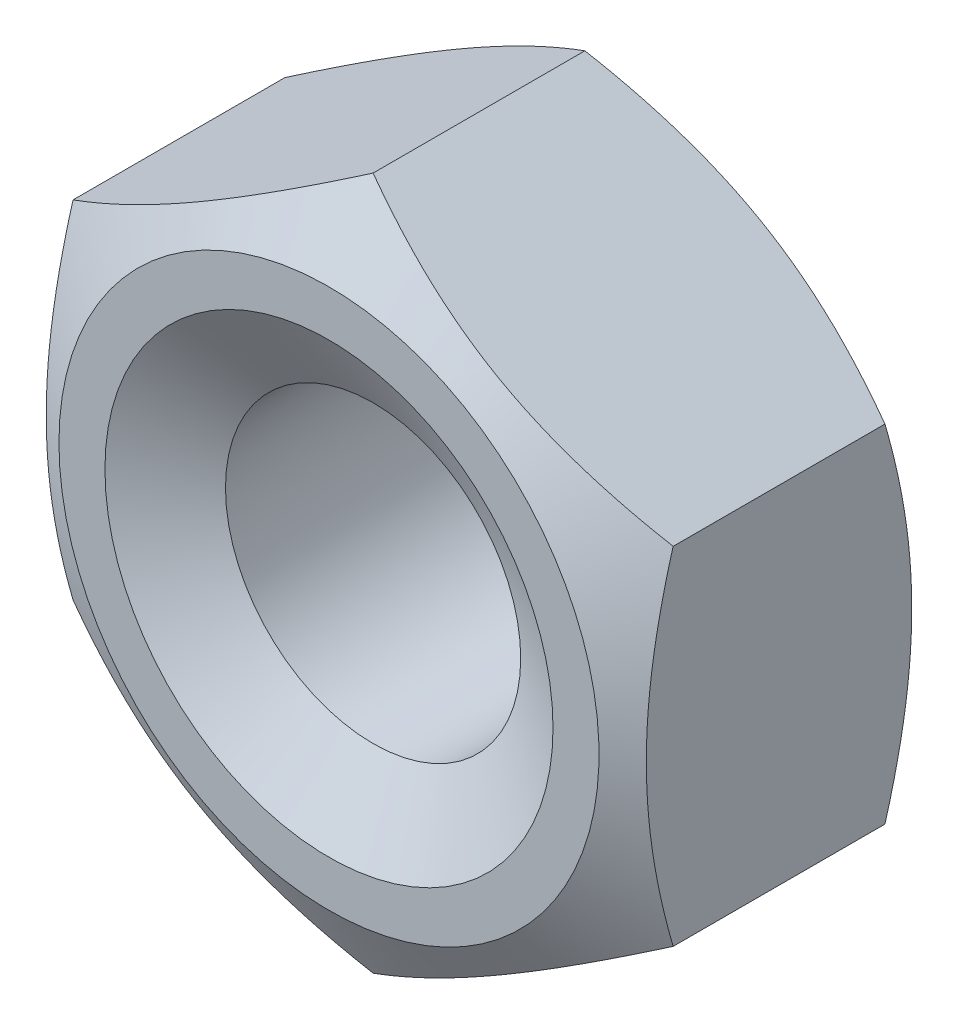
ISO-10303-21;
HEADER;
FILE_DESCRIPTION(('STEP AP214'),'2;1');
FILE_NAME('part.step','',(''),(''),'','','');
FILE_SCHEMA(('AUTOMOTIVE_DESIGN { 1 0 10303 214 1 1 1 1 }'));
ENDSEC;
DATA;
#1=APPLICATION_CONTEXT('core data for automotive mechanical design processes');
#2=APPLICATION_PROTOCOL_DEFINITION('international standard','automotive_design',2000,#1);
#3=PRODUCT_CONTEXT('',#1,'mechanical');
#4=PRODUCT('Part','Part','',(#3));
#5=PRODUCT_RELATED_PRODUCT_CATEGORY('part','',(#4));
#6=PRODUCT_DEFINITION_FORMATION('','',#4);
#7=PRODUCT_DEFINITION_CONTEXT('part definition',#1,'design');
#8=PRODUCT_DEFINITION('design','',#6,#7);
#9=PRODUCT_DEFINITION_SHAPE('','',#8);
#10=(LENGTH_UNIT() NAMED_UNIT(*) SI_UNIT(.MILLI.,.METRE.));
#11=(NAMED_UNIT(*) PLANE_ANGLE_UNIT() SI_UNIT($,.RADIAN.));
#12=(NAMED_UNIT(*) SI_UNIT($,.STERADIAN.) SOLID_ANGLE_UNIT());
#13=UNCERTAINTY_MEASURE_WITH_UNIT(LENGTH_MEASURE(1.E-05),#10,'distance_accuracy_value','');
#14=(GEOMETRIC_REPRESENTATION_CONTEXT(3) GLOBAL_UNCERTAINTY_ASSIGNED_CONTEXT((#13)) GLOBAL_UNIT_ASSIGNED_CONTEXT((#10,
#11,#12)) REPRESENTATION_CONTEXT('',''));
#15=CARTESIAN_POINT('',(0.,0.,0.));
#16=DIRECTION('',(0.,0.,1.));
#17=DIRECTION('',(1.,0.,0.));
#18=AXIS2_PLACEMENT_3D('',#15,#16,#17);
#19=CARTESIAN_POINT('',(0.,0.,0.));
#20=DIRECTION('',(0.,0.,-1.));
#21=DIRECTION('',(-1.,0.,0.));
#22=AXIS2_PLACEMENT_3D('',#19,#20,#21);
#23=CONICAL_SURFACE('',#22,3.73350269189626,1.0471975511966);
#24=CARTESIAN_POINT('',(0.,0.,0.735257121980021));
#25=DIRECTION('',(0.,0.,-1.));
#26=DIRECTION('',(-1.,0.,0.));
#27=AXIS2_PLACEMENT_3D('',#24,#25,#26);
#28=CIRCLE('',#27,2.46);
#29=CARTESIAN_POINT('',(-2.46,0.,0.735257121980021));
#30=VERTEX_POINT('',#29);
#31=EDGE_CURVE('E11',#30,#30,#28,.T.);
#32=ORIENTED_EDGE('',*,*,#31,.T.);
#33=EDGE_LOOP('',(#32));
#34=FACE_BOUND('',#33,.T.);
#35=CARTESIAN_POINT('',(0.,0.,0.));
#36=DIRECTION('',(0.,0.,-1.));
#37=DIRECTION('',(-1.,0.,0.));
#38=AXIS2_PLACEMENT_3D('',#35,#36,#37);
#39=CIRCLE('',#38,3.73350269189626);
#40=CARTESIAN_POINT('',(-3.73350269189626,0.,0.));
#41=VERTEX_POINT('',#40);
#42=EDGE_CURVE('E69',#41,#41,#39,.T.);
#43=ORIENTED_EDGE('',*,*,#42,.F.);
#44=EDGE_LOOP('',(#43));
#45=FACE_BOUND('',#44,.T.);
#46=ADVANCED_FACE('F56',(#34,#45),#23,.T.);
#47=CARTESIAN_POINT('',(0.,0.,0.));
#48=DIRECTION('',(0.,0.,-1.));
#49=DIRECTION('',(-1.,0.,0.));
#50=AXIS2_PLACEMENT_3D('',#47,#48,#49);
#51=CYLINDRICAL_SURFACE('',#50,2.46);
#52=CARTESIAN_POINT('',(0.,0.,0.));
#53=DIRECTION('',(0.,0.,-1.));
#54=DIRECTION('',(-1.,0.,0.));
#55=AXIS2_PLACEMENT_3D('',#52,#53,#54);
#56=CIRCLE('',#55,2.46);
#57=CARTESIAN_POINT('',(-2.46,0.,0.));
#58=VERTEX_POINT('',#57);
#59=EDGE_CURVE('E63',#58,#58,#56,.T.);
#60=ORIENTED_EDGE('',*,*,#59,.T.);
#61=EDGE_LOOP('',(#60));
#62=FACE_BOUND('',#61,.T.);
#63=ORIENTED_EDGE('',*,*,#31,.F.);
#64=EDGE_LOOP('',(#63));
#65=FACE_BOUND('',#64,.T.);
#66=ADVANCED_FACE('F83',(#62,#65),#51,.F.);
#67=CARTESIAN_POINT('',(0.,0.,0.));
#68=DIRECTION('',(0.,0.,1.));
#69=DIRECTION('',(1.,0.,0.));
#70=AXIS2_PLACEMENT_3D('',#67,#68,#69);
#71=PLANE('',#70);
#72=ORIENTED_EDGE('',*,*,#59,.F.);
#73=EDGE_LOOP('',(#72));
#74=FACE_BOUND('',#73,.T.);
#75=ORIENTED_EDGE('',*,*,#42,.T.);
#76=EDGE_LOOP('',(#75));
#77=FACE_BOUND('',#76,.T.);
#78=ADVANCED_FACE('F80',(#74,#77),#71,.F.);
#79=CLOSED_SHELL('',(#46,#66,#78));
#80=MANIFOLD_SOLID_BREP('B2_NOT_SHOWN',#79);
#81=CARTESIAN_POINT('',(0.,5.77350269189626,5.));
#82=DIRECTION('',(0.,0.,1.));
#83=DIRECTION('',(1.,0.,0.));
#84=AXIS2_PLACEMENT_3D('',#81,#82,#83);
#85=PLANE('',#84);
#86=CARTESIAN_POINT('',(0.,0.,5.));
#87=DIRECTION('',(0.,0.,-1.));
#88=DIRECTION('',(-1.,0.,0.));
#89=AXIS2_PLACEMENT_3D('',#86,#87,#88);
#90=CIRCLE('',#89,3.73350269189626);
#91=CARTESIAN_POINT('',(-3.73350269189626,0.,5.));
#92=VERTEX_POINT('',#91);
#93=EDGE_CURVE('E377',#92,#92,#90,.T.);
#94=ORIENTED_EDGE('',*,*,#93,.T.);
#95=EDGE_LOOP('',(#94));
#96=FACE_BOUND('',#95,.T.);
#97=CARTESIAN_POINT('',(0.,0.,5.));
#98=DIRECTION('',(0.,0.,-1.));
#99=DIRECTION('',(-1.,0.,0.));
#100=AXIS2_PLACEMENT_3D('',#97,#98,#99);
#101=CIRCLE('',#100,4.5);
#102=CARTESIAN_POINT('',(-4.5,0.,5.));
#103=VERTEX_POINT('',#102);
#104=EDGE_CURVE('E400',#103,#103,#101,.T.);
#105=ORIENTED_EDGE('',*,*,#104,.F.);
#106=EDGE_LOOP('',(#105));
#107=FACE_BOUND('',#106,.T.);
#108=ADVANCED_FACE('F135',(#96,#107),#85,.T.);
#109=CARTESIAN_POINT('',(5.,2.88675134594813,5.));
#110=DIRECTION('',(-0.5,-0.866025403784439,0.));
#111=DIRECTION('',(0.866025403784439,-0.5,0.));
#112=AXIS2_PLACEMENT_3D('',#109,#110,#111);
#113=PLANE('',#112);
#114=DIRECTION('',(0.,0.,-1.));
#115=VECTOR('',#114,1.);
#116=CARTESIAN_POINT('',(5.,2.88675134594813,5.));
#117=LINE('',#116,#115);
#118=CARTESIAN_POINT('',(5.,2.88675134594814,4.26474287801998));
#119=VERTEX_POINT('',#118);
#120=CARTESIAN_POINT('',(5.,2.88675134594813,0.735257121980021));
#121=VERTEX_POINT('',#120);
#122=EDGE_CURVE('E328',#119,#121,#117,.T.);
#123=ORIENTED_EDGE('',*,*,#122,.T.);
#124=CARTESIAN_POINT('',(5.0002,2.88663587589429,0.735323790646648));
#125=CARTESIAN_POINT('',(4.78046540547481,3.01349970319368,0.662061702232453));
#126=CARTESIAN_POINT('',(4.55885141554042,3.14144859993849,0.59542645651291));
#127=CARTESIAN_POINT('',(4.11178600454648,3.39956193532121,0.479114125605627));
#128=CARTESIAN_POINT('',(3.88632664040922,3.52973095989718,0.429478184510605));
#129=CARTESIAN_POINT('',(3.43816769477649,3.78847564779798,0.352226160013513));
#130=CARTESIAN_POINT('',(3.2155379068958,3.91701101576052,0.324095512878305));
#131=CARTESIAN_POINT('',(2.88081009815335,4.11026620624323,0.2988700565485));
#132=CARTESIAN_POINT('',(2.76915780319493,4.17472868879311,0.293288594364299));
#133=CARTESIAN_POINT('',(2.5457500293262,4.30371322717528,0.287877351346286));
#134=CARTESIAN_POINT('',(2.43399455370968,4.36823528110589,0.288047392853019));
#135=CARTESIAN_POINT('',(2.12781576914936,4.54500768479195,0.296428766386853));
#136=CARTESIAN_POINT('',(1.93349391403278,4.65719946015293,0.310504906492069));
#137=CARTESIAN_POINT('',(1.54613989800229,4.88083840557982,0.355140391704249));
#138=CARTESIAN_POINT('',(1.35310909862843,4.99228478956021,0.385714994742326));
#139=CARTESIAN_POINT('',(0.964974657525143,5.21637431361295,0.462143628215981));
#140=CARTESIAN_POINT('',(0.769920001358262,5.32898917185759,0.508321513473498));
#141=CARTESIAN_POINT('',(0.38271965464123,5.55253939626498,0.613126929086753));
#142=CARTESIAN_POINT('',(0.190569004591912,5.66347762579592,0.671729838032194));
#143=CARTESIAN_POINT('',(-0.000200000000000657,5.7736181619501,0.735323790646648));
#144=B_SPLINE_CURVE_WITH_KNOTS('',3,(#124,#125,#126,#127,#128,#129,#130,#131,#132,#133,#134,
#135,#136,#137,#138,#139,#140,#141,#142,#143),.UNSPECIFIED.,.F.,.F.,(4,2,2,2,2,2,2,2,2,4),(0.,
0.792555841363092,1.58701660053334,2.36181537487281,2.74884076077326,3.13585419177295,
3.8096236259968,4.48401723901189,5.17336882348929,5.86136694793725),.UNSPECIFIED.);
#145=CARTESIAN_POINT('',(0.,5.77350269189626,0.735257121980022));
#146=VERTEX_POINT('',#145);
#147=EDGE_CURVE('E158',#121,#146,#144,.T.);
#148=ORIENTED_EDGE('',*,*,#147,.T.);
#149=DIRECTION('',(0.,0.,-1.));
#150=VECTOR('',#149,1.);
#151=CARTESIAN_POINT('',(0.,5.77350269189626,5.));
#152=LINE('',#151,#150);
#153=CARTESIAN_POINT('',(0.,5.77350269189626,4.26474287801998));
#154=VERTEX_POINT('',#153);
#155=EDGE_CURVE('E212',#154,#146,#152,.T.);
#156=ORIENTED_EDGE('',*,*,#155,.F.);
#157=CARTESIAN_POINT('',(-0.000200000000000018,5.7736181619501,4.26467620935335));
#158=CARTESIAN_POINT('',(0.219534594525185,5.64675433465071,4.33793829776755));
#159=CARTESIAN_POINT('',(0.441148584459582,5.5188054379059,4.40457354348709));
#160=CARTESIAN_POINT('',(0.888213995453515,5.26069210252318,4.52088587439437));
#161=CARTESIAN_POINT('',(1.11367335959078,5.13052307794721,4.57052181548939));
#162=CARTESIAN_POINT('',(1.56183230522351,4.87177839004641,4.64777383998649));
#163=CARTESIAN_POINT('',(1.7844620931042,4.74324302208387,4.67590448712169));
#164=CARTESIAN_POINT('',(2.11918990184665,4.54998783160116,4.7011299434515));
#165=CARTESIAN_POINT('',(2.23084219680507,4.48552534905128,4.7067114056357));
#166=CARTESIAN_POINT('',(2.4542499706738,4.35654081066911,4.71212264865371));
#167=CARTESIAN_POINT('',(2.56600544629032,4.2920187567385,4.71195260714698));
#168=CARTESIAN_POINT('',(2.87218423085064,4.11524635305244,4.70357123361315));
#169=CARTESIAN_POINT('',(3.06650608596722,4.00305457769146,4.68949509350793));
#170=CARTESIAN_POINT('',(3.45386010199771,3.77941563226457,4.64485960829575));
#171=CARTESIAN_POINT('',(3.64689090137157,3.66796924828419,4.61428500525767));
#172=CARTESIAN_POINT('',(4.03502534247486,3.44387972423144,4.53785637178402));
#173=CARTESIAN_POINT('',(4.23007999864174,3.3312648659868,4.4916784865265));
#174=CARTESIAN_POINT('',(4.61728034535877,3.10771464157941,4.38687307091325));
#175=CARTESIAN_POINT('',(4.80943099540808,2.99677641204847,4.32827016196781));
#176=CARTESIAN_POINT('',(5.0002,2.88663587589429,4.26467620935335));
#177=B_SPLINE_CURVE_WITH_KNOTS('',3,(#157,#158,#159,#160,#161,#162,#163,#164,#165,#166,#167,
#168,#169,#170,#171,#172,#173,#174,#175,#176),.UNSPECIFIED.,.F.,.F.,(4,2,2,2,2,2,2,2,2,4),(0.,
0.792555841363093,1.58701660053334,2.36181537487281,2.74884076077326,3.13585419177296,
3.8096236259968,4.48401723901189,5.17336882348929,5.86136694793725),.UNSPECIFIED.);
#178=EDGE_CURVE('E316',#154,#119,#177,.T.);
#179=ORIENTED_EDGE('',*,*,#178,.T.);
#180=EDGE_LOOP('',(#123,#148,#156,#179));
#181=FACE_BOUND('',#180,.T.);
#182=ADVANCED_FACE('F137',(#181),#113,.F.);
#183=CARTESIAN_POINT('',(0.,5.77350269189626,5.));
#184=DIRECTION('',(0.5,-0.866025403784439,0.));
#185=DIRECTION('',(0.866025403784439,0.5,0.));
#186=AXIS2_PLACEMENT_3D('',#183,#184,#185);
#187=PLANE('',#186);
#188=ORIENTED_EDGE('',*,*,#155,.T.);
#189=CARTESIAN_POINT('',(0.00020000000000003,5.7736181619501,0.735323790646648));
#190=CARTESIAN_POINT('',(-0.219534594525185,5.64675433465071,0.662061702232454));
#191=CARTESIAN_POINT('',(-0.441148584459581,5.5188054379059,0.59542645651291));
#192=CARTESIAN_POINT('',(-0.888213995453514,5.26069210252318,0.479114125605628));
#193=CARTESIAN_POINT('',(-1.11367335959078,5.13052307794721,0.429478184510606));
#194=CARTESIAN_POINT('',(-1.56183230522351,4.87177839004641,0.352226160013514));
#195=CARTESIAN_POINT('',(-1.7844620931042,4.74324302208387,0.324095512878305));
#196=CARTESIAN_POINT('',(-2.11918990184665,4.54998783160116,0.2988700565485));
#197=CARTESIAN_POINT('',(-2.23084219680506,4.48552534905128,0.2932885943643));
#198=CARTESIAN_POINT('',(-2.4542499706738,4.35654081066911,0.287877351346286));
#199=CARTESIAN_POINT('',(-2.56600544629032,4.2920187567385,0.288047392853019));
#200=CARTESIAN_POINT('',(-2.87218423085064,4.11524635305244,0.296428766386852));
#201=CARTESIAN_POINT('',(-3.06650608596722,4.00305457769146,0.310504906492067));
#202=CARTESIAN_POINT('',(-3.45386010199771,3.77941563226457,0.355140391704247));
#203=CARTESIAN_POINT('',(-3.64689090137157,3.66796924828418,0.385714994742325));
#204=CARTESIAN_POINT('',(-4.03502534247486,3.44387972423144,0.462143628215981));
#205=CARTESIAN_POINT('',(-4.23007999864174,3.3312648659868,0.508321513473498));
#206=CARTESIAN_POINT('',(-4.61728034535877,3.1077146415794,0.613126929086753));
#207=CARTESIAN_POINT('',(-4.80943099540809,2.99677641204847,0.671729838032193));
#208=CARTESIAN_POINT('',(-5.0002,2.88663587589429,0.735323790646648));
#209=B_SPLINE_CURVE_WITH_KNOTS('',3,(#189,#190,#191,#192,#193,#194,#195,#196,#197,#198,#199,
#200,#201,#202,#203,#204,#205,#206,#207,#208),.UNSPECIFIED.,.F.,.F.,(4,2,2,2,2,2,2,2,2,4),(0.,
0.792555841363092,1.58701660053334,2.36181537487281,2.74884076077326,3.13585419177295,
3.8096236259968,4.4840172390119,5.17336882348929,5.86136694793726),.UNSPECIFIED.);
#210=CARTESIAN_POINT('',(-5.,2.88675134594813,0.735257121980022));
#211=VERTEX_POINT('',#210);
#212=EDGE_CURVE('E196',#146,#211,#209,.T.);
#213=ORIENTED_EDGE('',*,*,#212,.T.);
#214=DIRECTION('',(0.,0.,-1.));
#215=VECTOR('',#214,1.);
#216=CARTESIAN_POINT('',(-5.,2.88675134594813,5.));
#217=LINE('',#216,#215);
#218=CARTESIAN_POINT('',(-5.,2.88675134594813,4.26474287801998));
#219=VERTEX_POINT('',#218);
#220=EDGE_CURVE('E210',#219,#211,#217,.T.);
#221=ORIENTED_EDGE('',*,*,#220,.F.);
#222=CARTESIAN_POINT('',(-5.0002,2.88663587589429,4.26467620935335));
#223=CARTESIAN_POINT('',(-4.78046540547482,3.01349970319368,4.33793829776755));
#224=CARTESIAN_POINT('',(-4.55885141554042,3.14144859993849,4.40457354348709));
#225=CARTESIAN_POINT('',(-4.11178600454649,3.39956193532121,4.52088587439437));
#226=CARTESIAN_POINT('',(-3.88632664040923,3.52973095989718,4.57052181548939));
#227=CARTESIAN_POINT('',(-3.43816769477649,3.78847564779798,4.64777383998649));
#228=CARTESIAN_POINT('',(-3.21553790689581,3.91701101576052,4.6759044871217));
#229=CARTESIAN_POINT('',(-2.88081009815336,4.11026620624323,4.7011299434515));
#230=CARTESIAN_POINT('',(-2.76915780319494,4.17472868879311,4.7067114056357));
#231=CARTESIAN_POINT('',(-2.5457500293262,4.30371322717528,4.71212264865371));
#232=CARTESIAN_POINT('',(-2.43399455370968,4.36823528110589,4.71195260714698));
#233=CARTESIAN_POINT('',(-2.12781576914936,4.54500768479195,4.70357123361315));
#234=CARTESIAN_POINT('',(-1.93349391403278,4.65719946015293,4.68949509350793));
#235=CARTESIAN_POINT('',(-1.54613989800229,4.88083840557981,4.64485960829575));
#236=CARTESIAN_POINT('',(-1.35310909862843,4.9922847895602,4.61428500525768));
#237=CARTESIAN_POINT('',(-0.964974657525145,5.21637431361295,4.53785637178402));
#238=CARTESIAN_POINT('',(-0.769920001358264,5.32898917185759,4.4916784865265));
#239=CARTESIAN_POINT('',(-0.382719654641232,5.55253939626498,4.38687307091325));
#240=CARTESIAN_POINT('',(-0.190569004591914,5.66347762579592,4.32827016196781));
#241=CARTESIAN_POINT('',(0.000199999999999784,5.7736181619501,4.26467620935335));
#242=B_SPLINE_CURVE_WITH_KNOTS('',3,(#222,#223,#224,#225,#226,#227,#228,#229,#230,#231,#232,
#233,#234,#235,#236,#237,#238,#239,#240,#241),.UNSPECIFIED.,.F.,.F.,(4,2,2,2,2,2,2,2,2,4),(0.,
0.792555841363092,1.58701660053334,2.36181537487281,2.74884076077326,3.13585419177295,
3.8096236259968,4.48401723901189,5.17336882348929,5.86136694793725),.UNSPECIFIED.);
#243=EDGE_CURVE('E308',#219,#154,#242,.T.);
#244=ORIENTED_EDGE('',*,*,#243,.T.);
#245=EDGE_LOOP('',(#188,#213,#221,#244));
#246=FACE_BOUND('',#245,.T.);
#247=ADVANCED_FACE('F208',(#246),#187,.F.);
#248=CARTESIAN_POINT('',(-5.,2.88675134594813,5.));
#249=DIRECTION('',(1.,0.,0.));
#250=DIRECTION('',(0.,1.,0.));
#251=AXIS2_PLACEMENT_3D('',#248,#249,#250);
#252=PLANE('',#251);
#253=ORIENTED_EDGE('',*,*,#220,.T.);
#254=CARTESIAN_POINT('',(-5.,-7.61612296469539,2.66200392153949));
#255=CARTESIAN_POINT('',(-5.,-7.3988476158445,2.55716874415779));
#256=CARTESIAN_POINT('',(-5.,-7.18105836137724,2.45337961704452));
#257=CARTESIAN_POINT('',(-5.,-6.74417816397972,2.24848480183561));
#258=CARTESIAN_POINT('',(-5.,-6.52508700904771,2.14737956630337));
#259=CARTESIAN_POINT('',(-5.,-6.08413259779622,1.94790527042328));
#260=CARTESIAN_POINT('',(-5.,-5.86226063985759,1.8495553763216));
#261=CARTESIAN_POINT('',(-5.,-5.41670278932325,1.65706984255276));
#262=CARTESIAN_POINT('',(-5.,-5.19301698742059,1.56293399369733));
#263=CARTESIAN_POINT('',(-5.,-4.73683335905499,1.37729084629918));
#264=CARTESIAN_POINT('',(-5.,-4.50427025640604,1.28594304150539));
#265=CARTESIAN_POINT('',(-5.,-4.03637272941178,1.11050142590889));
#266=CARTESIAN_POINT('',(-5.,-3.80103799041133,1.02640844792394));
#267=CARTESIAN_POINT('',(-5.,-3.32770987156854,0.867785756804382));
#268=CARTESIAN_POINT('',(-5.,-3.08972347412201,0.793235425520008));
#269=CARTESIAN_POINT('',(-5.,-2.61034124861958,0.656180545294311));
#270=CARTESIAN_POINT('',(-5.,-2.3689465645915,0.593672052915869));
#271=CARTESIAN_POINT('',(-5.,-1.88391072502235,0.48411084199542));
#272=CARTESIAN_POINT('',(-5.,-1.64028744335491,0.436980490667321));
#273=CARTESIAN_POINT('',(-5.,-1.15016208594557,0.360936615040549));
#274=CARTESIAN_POINT('',(-5.,-0.903660241048868,0.332021640047692));
#275=CARTESIAN_POINT('',(-5.,-0.412167836582318,0.295095137393519));
#276=CARTESIAN_POINT('',(-5.,-0.167197127141315,0.286825859730162));
#277=CARTESIAN_POINT('',(-5.,0.322572125178174,0.291221269349882));
#278=CARTESIAN_POINT('',(-5.,0.567370661633245,0.303886700105887));
#279=CARTESIAN_POINT('',(-5.,0.987176681600412,0.342683845609202));
#280=CARTESIAN_POINT('',(-5.,1.16264470383296,0.364086189453041));
#281=CARTESIAN_POINT('',(-5.,1.51219623582242,0.416236772159425));
#282=CARTESIAN_POINT('',(-5.,1.68627953550816,0.446986402326248));
#283=CARTESIAN_POINT('',(-5.,2.20627627442159,0.551629071456484));
#284=CARTESIAN_POINT('',(-5.,2.54972248494743,0.637893586885888));
#285=CARTESIAN_POINT('',(-5.,3.06312534043305,0.786208966322251));
#286=CARTESIAN_POINT('',(-5.,3.23577281563497,0.839465105781236));
#287=CARTESIAN_POINT('',(-5.,3.5793891099625,0.951189850942844));
#288=CARTESIAN_POINT('',(-5.,3.75035791830709,1.00965849009782));
#289=CARTESIAN_POINT('',(-5.,4.09067759310444,1.13089674748973));
#290=CARTESIAN_POINT('',(-5.,4.26002904118043,1.1936647477359));
#291=CARTESIAN_POINT('',(-5.,4.59735042300934,1.32279524844679));
#292=CARTESIAN_POINT('',(-5.,4.76532036956931,1.38915771554605));
#293=CARTESIAN_POINT('',(-5.,5.14679238124429,1.5438320965092));
#294=CARTESIAN_POINT('',(-5.,5.35990712384178,1.63309722878193));
#295=CARTESIAN_POINT('',(-5.,5.78446139916688,1.81553586306377));
#296=CARTESIAN_POINT('',(-5.,5.99590085266595,1.90870954862178));
#297=CARTESIAN_POINT('',(-5.,6.41739680160835,2.09821647304696));
#298=CARTESIAN_POINT('',(-5.,6.62745306806032,2.1945502200296));
#299=CARTESIAN_POINT('',(-5.,7.04637313399046,2.38978001415496));
#300=CARTESIAN_POINT('',(-5.,7.25523691199796,2.48867610725612));
#301=CARTESIAN_POINT('',(-5.,7.88067587214187,2.78866319397647));
#302=CARTESIAN_POINT('',(-5.,8.29574525204228,2.99289210711034));
#303=CARTESIAN_POINT('',(-5.,9.12299779310589,3.40711301306338));
#304=CARTESIAN_POINT('',(-5.,9.53518086125088,3.61710519055424));
#305=CARTESIAN_POINT('',(-5.,10.1358760677506,3.92697297841169));
#306=CARTESIAN_POINT('',(-5.,10.3252343812012,4.02521292160799));
#307=CARTESIAN_POINT('',(-5.,10.7035454064949,4.22246321949996));
#308=CARTESIAN_POINT('',(-5.,10.8924981249519,4.32147356150922));
#309=CARTESIAN_POINT('',(-5.,11.458841082114,4.61951534535086));
#310=CARTESIAN_POINT('',(-5.,11.83570302451,4.81955077018509));
#311=CARTESIAN_POINT('',(-5.,12.5875213929433,5.22124631595249));
#312=CARTESIAN_POINT('',(-5.,12.9624801710524,5.42290204273538));
#313=CARTESIAN_POINT('',(-5.,13.7114958689632,5.82783984872194));
#314=CARTESIAN_POINT('',(-5.,14.0855528307602,6.0311218502132));
#315=CARTESIAN_POINT('',(-5.,14.4592734119702,6.23501663321153));
#316=B_SPLINE_CURVE_WITH_KNOTS('',3,(#254,#255,#256,#257,#258,#259,#260,#261,#262,#263,#264,
#265,#266,#267,#268,#269,#270,#271,#272,#273,#274,#275,#276,#277,#278,#279,#280,#281,#282,#283,
#284,#285,#286,#287,#288,#289,#290,#291,#292,#293,#294,#295,#296,#297,#298,#299,#300,#301,#302,
#303,#304,#305,#306,#307,#308,#309,#310,#311,#312,#313,#314,#315),.UNSPECIFIED.,.F.,.F.,(4,2,2,
2,2,2,2,2,2,2,2,2,2,2,2,2,2,2,2,2,2,2,2,2,2,2,2,2,2,2,4),(0.,0.72374356532308,1.44760840440169,
2.17565224855654,2.90365991191888,3.65314645187322,4.40271891495843,5.15064346196627,
5.8983226622335,6.64216678823823,7.38595166612236,8.12040330007615,8.85488101782472,
9.38492655137462,9.91505101863764,10.9759427430888,11.5179254075293,12.0599115505122,
12.6016948352162,13.1434730917078,13.8365852850357,14.5297300640043,15.22298684738,
15.9162560736827,17.3039592571645,18.6917069587139,19.331681227702,19.9716449802299,
21.2516167235484,22.5288486987305,23.8060200009785),.UNSPECIFIED.);
#317=CARTESIAN_POINT('',(-5.,-2.88675134594813,0.735257121980022));
#318=VERTEX_POINT('',#317);
#319=EDGE_CURVE('E193',#211,#318,#316,.F.);
#320=ORIENTED_EDGE('',*,*,#319,.T.);
#321=DIRECTION('',(0.,0.,-1.));
#322=VECTOR('',#321,1.);
#323=CARTESIAN_POINT('',(-5.,-2.88675134594813,5.));
#324=LINE('',#323,#322);
#325=CARTESIAN_POINT('',(-5.,-2.88675134594813,4.26474287801998));
#326=VERTEX_POINT('',#325);
#327=EDGE_CURVE('E219',#326,#318,#324,.T.);
#328=ORIENTED_EDGE('',*,*,#327,.F.);
#329=CARTESIAN_POINT('',(-5.,-7.61612296469539,2.33799607846051));
#330=CARTESIAN_POINT('',(-5.,-7.3988476158445,2.44283125584221));
#331=CARTESIAN_POINT('',(-5.,-7.18105836137724,2.54662038295548));
#332=CARTESIAN_POINT('',(-5.,-6.74417816397972,2.75151519816439));
#333=CARTESIAN_POINT('',(-5.,-6.52508700904771,2.85262043369663));
#334=CARTESIAN_POINT('',(-5.,-6.08413259779622,3.05209472957672));
#335=CARTESIAN_POINT('',(-5.,-5.86226063985759,3.1504446236784));
#336=CARTESIAN_POINT('',(-5.,-5.41670278932325,3.34293015744724));
#337=CARTESIAN_POINT('',(-5.,-5.19301698742059,3.43706600630266));
#338=CARTESIAN_POINT('',(-5.,-4.73683335905499,3.62270915370082));
#339=CARTESIAN_POINT('',(-5.,-4.50427025640604,3.71405695849461));
#340=CARTESIAN_POINT('',(-5.,-4.03637272941178,3.88949857409111));
#341=CARTESIAN_POINT('',(-5.,-3.80103799041133,3.97359155207606));
#342=CARTESIAN_POINT('',(-5.,-3.32770987156854,4.13221424319562));
#343=CARTESIAN_POINT('',(-5.,-3.08972347412201,4.20676457447999));
#344=CARTESIAN_POINT('',(-5.,-2.61034124861958,4.34381945470569));
#345=CARTESIAN_POINT('',(-5.,-2.3689465645915,4.40632794708413));
#346=CARTESIAN_POINT('',(-5.,-1.88391072502235,4.51588915800458));
#347=CARTESIAN_POINT('',(-5.,-1.64028744335491,4.56301950933268));
#348=CARTESIAN_POINT('',(-5.,-1.15016208594557,4.63906338495945));
#349=CARTESIAN_POINT('',(-5.,-0.903660241048869,4.66797835995231));
#350=CARTESIAN_POINT('',(-5.,-0.412167836582318,4.70490486260648));
#351=CARTESIAN_POINT('',(-5.,-0.167197127141315,4.71317414026984));
#352=CARTESIAN_POINT('',(-5.,0.322572125178173,4.70877873065012));
#353=CARTESIAN_POINT('',(-5.,0.567370661633245,4.69611329989411));
#354=CARTESIAN_POINT('',(-5.,0.987176681600411,4.6573161543908));
#355=CARTESIAN_POINT('',(-5.,1.16264470383296,4.63591381054696));
#356=CARTESIAN_POINT('',(-5.,1.51219623582242,4.58376322784057));
#357=CARTESIAN_POINT('',(-5.,1.68627953550816,4.55301359767375));
#358=CARTESIAN_POINT('',(-5.,2.20627627442159,4.44837092854352));
#359=CARTESIAN_POINT('',(-5.,2.54972248494743,4.36210641311411));
#360=CARTESIAN_POINT('',(-5.,3.06312534043305,4.21379103367775));
#361=CARTESIAN_POINT('',(-5.,3.23577281563497,4.16053489421876));
#362=CARTESIAN_POINT('',(-5.,3.5793891099625,4.04881014905716));
#363=CARTESIAN_POINT('',(-5.,3.75035791830709,3.99034150990218));
#364=CARTESIAN_POINT('',(-5.,4.09067759310444,3.86910325251027));
#365=CARTESIAN_POINT('',(-5.,4.26002904118043,3.8063352522641));
#366=CARTESIAN_POINT('',(-5.,4.59735042300934,3.67720475155321));
#367=CARTESIAN_POINT('',(-5.,4.76532036956931,3.61084228445395));
#368=CARTESIAN_POINT('',(-5.,5.14679238124429,3.4561679034908));
#369=CARTESIAN_POINT('',(-5.,5.35990712384178,3.36690277121807));
#370=CARTESIAN_POINT('',(-5.,5.78446139916688,3.18446413693623));
#371=CARTESIAN_POINT('',(-5.,5.99590085266595,3.09129045137822));
#372=CARTESIAN_POINT('',(-5.,6.41739680160835,2.90178352695304));
#373=CARTESIAN_POINT('',(-5.,6.62745306806032,2.8054497799704));
#374=CARTESIAN_POINT('',(-5.,7.04637313399046,2.61021998584504));
#375=CARTESIAN_POINT('',(-5.,7.25523691199796,2.51132389274388));
#376=CARTESIAN_POINT('',(-5.,7.88067587214187,2.21133680602353));
#377=CARTESIAN_POINT('',(-5.,8.29574525204228,2.00710789288966));
#378=CARTESIAN_POINT('',(-5.,9.12299779310589,1.59288698693662));
#379=CARTESIAN_POINT('',(-5.,9.53518086125088,1.38289480944576));
#380=CARTESIAN_POINT('',(-5.,10.1358760677506,1.07302702158831));
#381=CARTESIAN_POINT('',(-5.,10.3252343812012,0.97478707839201));
#382=CARTESIAN_POINT('',(-5.,10.7035454064949,0.777536780500037));
#383=CARTESIAN_POINT('',(-5.,10.8924981249519,0.678526438490782));
#384=CARTESIAN_POINT('',(-5.,11.458841082114,0.380484654649137));
#385=CARTESIAN_POINT('',(-5.,11.83570302451,0.180449229814916));
#386=CARTESIAN_POINT('',(-5.,12.5875213929433,-0.221246315952493));
#387=CARTESIAN_POINT('',(-5.,12.9624801710524,-0.422902042735383));
#388=CARTESIAN_POINT('',(-5.,13.7114958689632,-0.827839848721942));
#389=CARTESIAN_POINT('',(-5.,14.0855528307602,-1.0311218502132));
#390=CARTESIAN_POINT('',(-5.,14.4592734119702,-1.23501663321153));
#391=B_SPLINE_CURVE_WITH_KNOTS('',3,(#329,#330,#331,#332,#333,#334,#335,#336,#337,#338,#339,
#340,#341,#342,#343,#344,#345,#346,#347,#348,#349,#350,#351,#352,#353,#354,#355,#356,#357,#358,
#359,#360,#361,#362,#363,#364,#365,#366,#367,#368,#369,#370,#371,#372,#373,#374,#375,#376,#377,
#378,#379,#380,#381,#382,#383,#384,#385,#386,#387,#388,#389,#390),.UNSPECIFIED.,.F.,.F.,(4,2,2,
2,2,2,2,2,2,2,2,2,2,2,2,2,2,2,2,2,2,2,2,2,2,2,2,2,2,2,4),(0.,0.72374356532308,1.44760840440169,
2.17565224855654,2.90365991191888,3.65314645187322,4.40271891495843,5.15064346196627,
5.8983226622335,6.64216678823823,7.38595166612236,8.12040330007615,8.85488101782472,
9.38492655137462,9.91505101863764,10.9759427430888,11.5179254075293,12.0599115505122,
12.6016948352162,13.1434730917078,13.8365852850357,14.5297300640043,15.22298684738,
15.9162560736827,17.3039592571645,18.6917069587139,19.331681227702,19.9716449802299,
21.2516167235484,22.5288486987305,23.8060200009786),.UNSPECIFIED.);
#392=EDGE_CURVE('E217',#326,#219,#391,.T.);
#393=ORIENTED_EDGE('',*,*,#392,.T.);
#394=EDGE_LOOP('',(#253,#320,#328,#393));
#395=FACE_BOUND('',#394,.T.);
#396=ADVANCED_FACE('F216',(#395),#252,.F.);
#397=CARTESIAN_POINT('',(-5.,-2.88675134594813,5.));
#398=DIRECTION('',(0.5,0.866025403784438,0.));
#399=DIRECTION('',(-0.866025403784439,0.5,0.));
#400=AXIS2_PLACEMENT_3D('',#397,#398,#399);
#401=PLANE('',#400);
#402=ORIENTED_EDGE('',*,*,#327,.T.);
#403=CARTESIAN_POINT('',(-5.0002,-2.88663587589429,0.735323790646647));
#404=CARTESIAN_POINT('',(-4.78046540547481,-3.01349970319368,0.662061702232453));
#405=CARTESIAN_POINT('',(-4.55885141554042,-3.14144859993849,0.595426456512909));
#406=CARTESIAN_POINT('',(-4.11178600454649,-3.39956193532121,0.479114125605627));
#407=CARTESIAN_POINT('',(-3.88632664040922,-3.52973095989718,0.429478184510604));
#408=CARTESIAN_POINT('',(-3.43816769477649,-3.78847564779798,0.352226160013513));
#409=CARTESIAN_POINT('',(-3.21553790689581,-3.91701101576052,0.324095512878304));
#410=CARTESIAN_POINT('',(-2.88081009815336,-4.11026620624323,0.298870056548499));
#411=CARTESIAN_POINT('',(-2.76915780319494,-4.17472868879311,0.293288594364298));
#412=CARTESIAN_POINT('',(-2.5457500293262,-4.30371322717528,0.287877351346285));
#413=CARTESIAN_POINT('',(-2.43399455370968,-4.36823528110589,0.288047392853018));
#414=CARTESIAN_POINT('',(-2.12781576914936,-4.54500768479194,0.296428766386852));
#415=CARTESIAN_POINT('',(-1.93349391403278,-4.65719946015293,0.310504906492067));
#416=CARTESIAN_POINT('',(-1.54613989800229,-4.88083840557981,0.355140391704247));
#417=CARTESIAN_POINT('',(-1.35310909862843,-4.9922847895602,0.385714994742324));
#418=CARTESIAN_POINT('',(-0.964974657525144,-5.21637431361295,0.462143628215981));
#419=CARTESIAN_POINT('',(-0.769920001358264,-5.32898917185759,0.508321513473498));
#420=CARTESIAN_POINT('',(-0.382719654641232,-5.55253939626498,0.613126929086753));
#421=CARTESIAN_POINT('',(-0.190569004591914,-5.66347762579592,0.671729838032193));
#422=CARTESIAN_POINT('',(0.00019999999999857,-5.7736181619501,0.735323790646648));
#423=B_SPLINE_CURVE_WITH_KNOTS('',3,(#403,#404,#405,#406,#407,#408,#409,#410,#411,#412,#413,
#414,#415,#416,#417,#418,#419,#420,#421,#422),.UNSPECIFIED.,.F.,.F.,(4,2,2,2,2,2,2,2,2,4),(0.,
0.792555841363092,1.58701660053334,2.36181537487281,2.74884076077326,3.13585419177295,
3.80962362599679,4.48401723901189,5.17336882348929,5.86136694793725),.UNSPECIFIED.);
#424=CARTESIAN_POINT('',(0.,-5.77350269189626,0.735257121980022));
#425=VERTEX_POINT('',#424);
#426=EDGE_CURVE('E198',#318,#425,#423,.T.);
#427=ORIENTED_EDGE('',*,*,#426,.T.);
#428=DIRECTION('',(0.,0.,-1.));
#429=VECTOR('',#428,1.);
#430=CARTESIAN_POINT('',(0.,-5.77350269189626,5.));
#431=LINE('',#430,#429);
#432=CARTESIAN_POINT('',(0.,-5.77350269189626,4.26474287801998));
#433=VERTEX_POINT('',#432);
#434=EDGE_CURVE('E226',#433,#425,#431,.T.);
#435=ORIENTED_EDGE('',*,*,#434,.F.);
#436=CARTESIAN_POINT('',(0.000199999999999169,-5.7736181619501,4.26467620935335));
#437=CARTESIAN_POINT('',(-0.219534594525186,-5.64675433465071,4.33793829776755));
#438=CARTESIAN_POINT('',(-0.441148584459582,-5.5188054379059,4.40457354348709));
#439=CARTESIAN_POINT('',(-0.888213995453515,-5.26069210252318,4.52088587439437));
#440=CARTESIAN_POINT('',(-1.11367335959078,-5.13052307794721,4.5705218154894));
#441=CARTESIAN_POINT('',(-1.56183230522351,-4.87177839004641,4.64777383998649));
#442=CARTESIAN_POINT('',(-1.7844620931042,-4.74324302208387,4.6759044871217));
#443=CARTESIAN_POINT('',(-2.11918990184664,-4.54998783160116,4.7011299434515));
#444=CARTESIAN_POINT('',(-2.23084219680506,-4.48552534905128,4.7067114056357));
#445=CARTESIAN_POINT('',(-2.4542499706738,-4.35654081066911,4.71212264865371));
#446=CARTESIAN_POINT('',(-2.56600544629032,-4.2920187567385,4.71195260714698));
#447=CARTESIAN_POINT('',(-2.87218423085064,-4.11524635305244,4.70357123361315));
#448=CARTESIAN_POINT('',(-3.06650608596722,-4.00305457769146,4.68949509350793));
#449=CARTESIAN_POINT('',(-3.45386010199771,-3.77941563226457,4.64485960829575));
#450=CARTESIAN_POINT('',(-3.64689090137157,-3.66796924828418,4.61428500525768));
#451=CARTESIAN_POINT('',(-4.03502534247486,-3.44387972423144,4.53785637178402));
#452=CARTESIAN_POINT('',(-4.23007999864174,-3.3312648659868,4.4916784865265));
#453=CARTESIAN_POINT('',(-4.61728034535877,-3.1077146415794,4.38687307091325));
#454=CARTESIAN_POINT('',(-4.80943099540809,-2.99677641204847,4.32827016196781));
#455=CARTESIAN_POINT('',(-5.0002,-2.88663587589429,4.26467620935335));
#456=B_SPLINE_CURVE_WITH_KNOTS('',3,(#436,#437,#438,#439,#440,#441,#442,#443,#444,#445,#446,
#447,#448,#449,#450,#451,#452,#453,#454,#455),.UNSPECIFIED.,.F.,.F.,(4,2,2,2,2,2,2,2,2,4),(0.,
0.792555841363092,1.58701660053334,2.36181537487281,2.74884076077326,3.13585419177295,
3.8096236259968,4.48401723901189,5.17336882348929,5.86136694793725),.UNSPECIFIED.);
#457=EDGE_CURVE('E343',#433,#326,#456,.T.);
#458=ORIENTED_EDGE('',*,*,#457,.T.);
#459=EDGE_LOOP('',(#402,#427,#435,#458));
#460=FACE_BOUND('',#459,.T.);
#461=ADVANCED_FACE('F251',(#460),#401,.F.);
#462=CARTESIAN_POINT('',(0.,-5.77350269189626,5.));
#463=DIRECTION('',(-0.5,0.866025403784439,0.));
#464=DIRECTION('',(-0.866025403784439,-0.5,0.));
#465=AXIS2_PLACEMENT_3D('',#462,#463,#464);
#466=PLANE('',#465);
#467=ORIENTED_EDGE('',*,*,#434,.T.);
#468=CARTESIAN_POINT('',(-0.000200000000000885,-5.7736181619501,0.735323790646648));
#469=CARTESIAN_POINT('',(0.219534594525184,-5.64675433465071,0.662061702232453));
#470=CARTESIAN_POINT('',(0.44114858445958,-5.5188054379059,0.595426456512909));
#471=CARTESIAN_POINT('',(0.888213995453513,-5.26069210252318,0.479114125605627));
#472=CARTESIAN_POINT('',(1.11367335959077,-5.13052307794721,0.429478184510605));
#473=CARTESIAN_POINT('',(1.56183230522351,-4.87177839004641,0.352226160013513));
#474=CARTESIAN_POINT('',(1.78446209310419,-4.74324302208387,0.324095512878304));
#475=CARTESIAN_POINT('',(2.11918990184664,-4.54998783160116,0.2988700565485));
#476=CARTESIAN_POINT('',(2.23084219680506,-4.48552534905128,0.293288594364299));
#477=CARTESIAN_POINT('',(2.4542499706738,-4.35654081066911,0.287877351346286));
#478=CARTESIAN_POINT('',(2.56600544629032,-4.2920187567385,0.288047392853019));
#479=CARTESIAN_POINT('',(2.87218423085064,-4.11524635305244,0.296428766386853));
#480=CARTESIAN_POINT('',(3.06650608596722,-4.00305457769146,0.310504906492067));
#481=CARTESIAN_POINT('',(3.45386010199771,-3.77941563226457,0.355140391704247));
#482=CARTESIAN_POINT('',(3.64689090137157,-3.66796924828419,0.385714994742325));
#483=CARTESIAN_POINT('',(4.03502534247485,-3.44387972423144,0.462143628215981));
#484=CARTESIAN_POINT('',(4.23007999864174,-3.3312648659868,0.508321513473498));
#485=CARTESIAN_POINT('',(4.61728034535877,-3.10771464157941,0.613126929086752));
#486=CARTESIAN_POINT('',(4.80943099540809,-2.99677641204847,0.671729838032192));
#487=CARTESIAN_POINT('',(5.0002,-2.88663587589429,0.735323790646647));
#488=B_SPLINE_CURVE_WITH_KNOTS('',3,(#468,#469,#470,#471,#472,#473,#474,#475,#476,#477,#478,
#479,#480,#481,#482,#483,#484,#485,#486,#487),.UNSPECIFIED.,.F.,.F.,(4,2,2,2,2,2,2,2,2,4),(0.,
0.792555841363092,1.58701660053334,2.36181537487281,2.74884076077326,3.13585419177295,
3.8096236259968,4.48401723901189,5.17336882348929,5.86136694793725),.UNSPECIFIED.);
#489=CARTESIAN_POINT('',(5.,-2.88675134594814,0.735257121980022));
#490=VERTEX_POINT('',#489);
#491=EDGE_CURVE('E264',#425,#490,#488,.T.);
#492=ORIENTED_EDGE('',*,*,#491,.T.);
#493=DIRECTION('',(0.,0.,-1.));
#494=VECTOR('',#493,1.);
#495=CARTESIAN_POINT('',(5.,-2.88675134594813,5.));
#496=LINE('',#495,#494);
#497=CARTESIAN_POINT('',(5.,-2.88675134594813,4.26474287801998));
#498=VERTEX_POINT('',#497);
#499=EDGE_CURVE('E332',#498,#490,#496,.T.);
#500=ORIENTED_EDGE('',*,*,#499,.F.);
#501=CARTESIAN_POINT('',(5.0002,-2.88663587589429,4.26467620935335));
#502=CARTESIAN_POINT('',(4.78046540547481,-3.01349970319368,4.33793829776755));
#503=CARTESIAN_POINT('',(4.55885141554042,-3.14144859993849,4.40457354348709));
#504=CARTESIAN_POINT('',(4.11178600454648,-3.39956193532121,4.52088587439437));
#505=CARTESIAN_POINT('',(3.88632664040922,-3.52973095989718,4.57052181548939));
#506=CARTESIAN_POINT('',(3.43816769477649,-3.78847564779798,4.64777383998649));
#507=CARTESIAN_POINT('',(3.2155379068958,-3.91701101576052,4.6759044871217));
#508=CARTESIAN_POINT('',(2.88081009815335,-4.11026620624323,4.7011299434515));
#509=CARTESIAN_POINT('',(2.76915780319493,-4.17472868879311,4.7067114056357));
#510=CARTESIAN_POINT('',(2.5457500293262,-4.30371322717528,4.71212264865371));
#511=CARTESIAN_POINT('',(2.43399455370968,-4.36823528110589,4.71195260714698));
#512=CARTESIAN_POINT('',(2.12781576914936,-4.54500768479195,4.70357123361315));
#513=CARTESIAN_POINT('',(1.93349391403278,-4.65719946015293,4.68949509350793));
#514=CARTESIAN_POINT('',(1.54613989800229,-4.88083840557981,4.64485960829575));
#515=CARTESIAN_POINT('',(1.35310909862843,-4.9922847895602,4.61428500525768));
#516=CARTESIAN_POINT('',(0.964974657525142,-5.21637431361295,4.53785637178402));
#517=CARTESIAN_POINT('',(0.769920001358261,-5.32898917185759,4.4916784865265));
#518=CARTESIAN_POINT('',(0.38271965464123,-5.55253939626498,4.38687307091325));
#519=CARTESIAN_POINT('',(0.190569004591912,-5.66347762579592,4.32827016196781));
#520=CARTESIAN_POINT('',(-0.000200000000001125,-5.7736181619501,4.26467620935335));
#521=B_SPLINE_CURVE_WITH_KNOTS('',3,(#501,#502,#503,#504,#505,#506,#507,#508,#509,#510,#511,
#512,#513,#514,#515,#516,#517,#518,#519,#520),.UNSPECIFIED.,.F.,.F.,(4,2,2,2,2,2,2,2,2,4),(0.,
0.792555841363092,1.58701660053334,2.36181537487281,2.74884076077326,3.13585419177295,
3.80962362599679,4.48401723901189,5.17336882348929,5.86136694793725),.UNSPECIFIED.);
#522=EDGE_CURVE('E165',#498,#433,#521,.T.);
#523=ORIENTED_EDGE('',*,*,#522,.T.);
#524=EDGE_LOOP('',(#467,#492,#500,#523));
#525=FACE_BOUND('',#524,.T.);
#526=ADVANCED_FACE('F243',(#525),#466,.F.);
#527=CARTESIAN_POINT('',(5.,-2.88675134594813,5.));
#528=DIRECTION('',(-1.,0.,0.));
#529=DIRECTION('',(0.,0.,1.));
#530=AXIS2_PLACEMENT_3D('',#527,#528,#529);
#531=PLANE('',#530);
#532=ORIENTED_EDGE('',*,*,#499,.T.);
#533=CARTESIAN_POINT('',(5.,-7.61612296469539,2.66200392153949));
#534=CARTESIAN_POINT('',(5.,-7.39884761584451,2.55716874415779));
#535=CARTESIAN_POINT('',(5.,-7.18105836137724,2.45337961704452));
#536=CARTESIAN_POINT('',(5.,-6.74417816397972,2.24848480183561));
#537=CARTESIAN_POINT('',(5.,-6.52508700904771,2.14737956630337));
#538=CARTESIAN_POINT('',(5.,-6.08413259779622,1.94790527042328));
#539=CARTESIAN_POINT('',(5.,-5.8622606398576,1.8495553763216));
#540=CARTESIAN_POINT('',(5.,-5.41670278932325,1.65706984255276));
#541=CARTESIAN_POINT('',(5.,-5.19301698742059,1.56293399369733));
#542=CARTESIAN_POINT('',(5.,-4.73683335905499,1.37729084629918));
#543=CARTESIAN_POINT('',(5.,-4.50427025640605,1.28594304150539));
#544=CARTESIAN_POINT('',(5.,-4.03637272941178,1.11050142590889));
#545=CARTESIAN_POINT('',(5.,-3.80103799041133,1.02640844792394));
#546=CARTESIAN_POINT('',(5.,-3.32770987156854,0.867785756804381));
#547=CARTESIAN_POINT('',(5.,-3.08972347412202,0.793235425520007));
#548=CARTESIAN_POINT('',(5.,-2.61034124861958,0.65618054529431));
#549=CARTESIAN_POINT('',(5.,-2.3689465645915,0.593672052915869));
#550=CARTESIAN_POINT('',(5.,-1.88391072502235,0.48411084199542));
#551=CARTESIAN_POINT('',(5.,-1.64028744335491,0.43698049066732));
#552=CARTESIAN_POINT('',(5.,-1.15016208594557,0.360936615040548));
#553=CARTESIAN_POINT('',(5.,-0.90366024104887,0.332021640047691));
#554=CARTESIAN_POINT('',(5.,-0.412167836582321,0.295095137393517));
#555=CARTESIAN_POINT('',(5.,-0.167197127141318,0.28682585973016));
#556=CARTESIAN_POINT('',(5.,0.32257212517817,0.291221269349881));
#557=CARTESIAN_POINT('',(5.,0.567370661633241,0.303886700105885));
#558=CARTESIAN_POINT('',(5.,0.987176681600408,0.342683845609201));
#559=CARTESIAN_POINT('',(5.,1.16264470383296,0.364086189453039));
#560=CARTESIAN_POINT('',(5.,1.51219623582242,0.416236772159424));
#561=CARTESIAN_POINT('',(5.,1.68627953550815,0.446986402326246));
#562=CARTESIAN_POINT('',(5.,2.20627627442158,0.551629071456481));
#563=CARTESIAN_POINT('',(5.,2.54972248494743,0.637893586885885));
#564=CARTESIAN_POINT('',(5.,3.06312534043305,0.786208966322248));
#565=CARTESIAN_POINT('',(5.,3.23577281563496,0.839465105781233));
#566=CARTESIAN_POINT('',(5.,3.57938910996249,0.951189850942841));
#567=CARTESIAN_POINT('',(5.,3.75035791830708,1.00965849009782));
#568=CARTESIAN_POINT('',(5.,4.09067759310444,1.13089674748973));
#569=CARTESIAN_POINT('',(5.,4.26002904118042,1.1936647477359));
#570=CARTESIAN_POINT('',(5.,4.59735042300933,1.32279524844678));
#571=CARTESIAN_POINT('',(5.,4.76532036956931,1.38915771554605));
#572=CARTESIAN_POINT('',(5.,5.14679238124429,1.54383209650919));
#573=CARTESIAN_POINT('',(5.,5.35990712384177,1.63309722878193));
#574=CARTESIAN_POINT('',(5.,5.78446139916688,1.81553586306377));
#575=CARTESIAN_POINT('',(5.,5.99590085266595,1.90870954862178));
#576=CARTESIAN_POINT('',(5.,6.41739680160835,2.09821647304696));
#577=CARTESIAN_POINT('',(5.,6.62745306806032,2.19455022002959));
#578=CARTESIAN_POINT('',(5.,7.04637313399046,2.38978001415495));
#579=CARTESIAN_POINT('',(5.,7.25523691199796,2.48867610725612));
#580=CARTESIAN_POINT('',(5.,7.88067587214187,2.78866319397647));
#581=CARTESIAN_POINT('',(5.,8.29574525204228,2.99289210711034));
#582=CARTESIAN_POINT('',(5.,9.12299779310589,3.40711301306338));
#583=CARTESIAN_POINT('',(5.,9.53518086125088,3.61710519055424));
#584=CARTESIAN_POINT('',(5.,10.1358760677506,3.92697297841169));
#585=CARTESIAN_POINT('',(5.,10.3252343812012,4.02521292160799));
#586=CARTESIAN_POINT('',(5.,10.7035454064949,4.22246321949996));
#587=CARTESIAN_POINT('',(5.,10.8924981249519,4.32147356150922));
#588=CARTESIAN_POINT('',(5.,11.458841082114,4.61951534535086));
#589=CARTESIAN_POINT('',(5.,11.83570302451,4.81955077018508));
#590=CARTESIAN_POINT('',(5.,12.5875213929433,5.22124631595249));
#591=CARTESIAN_POINT('',(5.,12.9624801710524,5.42290204273538));
#592=CARTESIAN_POINT('',(5.,13.7114958689632,5.82783984872194));
#593=CARTESIAN_POINT('',(5.,14.0855528307602,6.0311218502132));
#594=CARTESIAN_POINT('',(5.,14.4592734119702,6.23501663321153));
#595=B_SPLINE_CURVE_WITH_KNOTS('',3,(#533,#534,#535,#536,#537,#538,#539,#540,#541,#542,#543,
#544,#545,#546,#547,#548,#549,#550,#551,#552,#553,#554,#555,#556,#557,#558,#559,#560,#561,#562,
#563,#564,#565,#566,#567,#568,#569,#570,#571,#572,#573,#574,#575,#576,#577,#578,#579,#580,#581,
#582,#583,#584,#585,#586,#587,#588,#589,#590,#591,#592,#593,#594),.UNSPECIFIED.,.F.,.F.,(4,2,2,
2,2,2,2,2,2,2,2,2,2,2,2,2,2,2,2,2,2,2,2,2,2,2,2,2,2,2,4),(0.,0.72374356532308,1.44760840440169,
2.17565224855654,2.90365991191888,3.65314645187322,4.40271891495843,5.15064346196627,
5.8983226622335,6.64216678823823,7.38595166612236,8.12040330007614,8.85488101782472,
9.38492655137461,9.91505101863763,10.9759427430888,11.5179254075293,12.0599115505121,
12.6016948352162,13.1434730917078,13.8365852850357,14.5297300640043,15.22298684738,
15.9162560736827,17.3039592571645,18.6917069587139,19.331681227702,19.9716449802299,
21.2516167235484,22.5288486987305,23.8060200009786),.UNSPECIFIED.);
#596=EDGE_CURVE('E54',#490,#121,#595,.T.);
#597=ORIENTED_EDGE('',*,*,#596,.T.);
#598=ORIENTED_EDGE('',*,*,#122,.F.);
#599=CARTESIAN_POINT('',(5.,-7.61612296469539,2.33799607846051));
#600=CARTESIAN_POINT('',(5.,-7.39884761584451,2.44283125584221));
#601=CARTESIAN_POINT('',(5.,-7.18105836137724,2.54662038295548));
#602=CARTESIAN_POINT('',(5.,-6.74417816397972,2.75151519816439));
#603=CARTESIAN_POINT('',(5.,-6.52508700904771,2.85262043369663));
#604=CARTESIAN_POINT('',(5.,-6.08413259779622,3.05209472957672));
#605=CARTESIAN_POINT('',(5.,-5.8622606398576,3.1504446236784));
#606=CARTESIAN_POINT('',(5.,-5.41670278932325,3.34293015744724));
#607=CARTESIAN_POINT('',(5.,-5.19301698742059,3.43706600630267));
#608=CARTESIAN_POINT('',(5.,-4.73683335905499,3.62270915370082));
#609=CARTESIAN_POINT('',(5.,-4.50427025640605,3.71405695849461));
#610=CARTESIAN_POINT('',(5.,-4.03637272941178,3.88949857409111));
#611=CARTESIAN_POINT('',(5.,-3.80103799041134,3.97359155207606));
#612=CARTESIAN_POINT('',(5.,-3.32770987156854,4.13221424319562));
#613=CARTESIAN_POINT('',(5.,-3.08972347412202,4.20676457447999));
#614=CARTESIAN_POINT('',(5.,-2.61034124861958,4.34381945470569));
#615=CARTESIAN_POINT('',(5.,-2.3689465645915,4.40632794708413));
#616=CARTESIAN_POINT('',(5.,-1.88391072502235,4.51588915800458));
#617=CARTESIAN_POINT('',(5.,-1.64028744335491,4.56301950933268));
#618=CARTESIAN_POINT('',(5.,-1.15016208594557,4.63906338495945));
#619=CARTESIAN_POINT('',(5.,-0.903660241048871,4.66797835995231));
#620=CARTESIAN_POINT('',(5.,-0.412167836582321,4.70490486260648));
#621=CARTESIAN_POINT('',(5.,-0.167197127141318,4.71317414026984));
#622=CARTESIAN_POINT('',(5.,0.322572125178171,4.70877873065012));
#623=CARTESIAN_POINT('',(5.,0.567370661633241,4.69611329989411));
#624=CARTESIAN_POINT('',(5.,0.987176681600408,4.6573161543908));
#625=CARTESIAN_POINT('',(5.,1.16264470383296,4.63591381054696));
#626=CARTESIAN_POINT('',(5.,1.51219623582242,4.58376322784058));
#627=CARTESIAN_POINT('',(5.,1.68627953550815,4.55301359767375));
#628=CARTESIAN_POINT('',(5.,2.20627627442158,4.44837092854352));
#629=CARTESIAN_POINT('',(5.,2.54972248494743,4.36210641311412));
#630=CARTESIAN_POINT('',(5.,3.06312534043305,4.21379103367775));
#631=CARTESIAN_POINT('',(5.,3.23577281563496,4.16053489421877));
#632=CARTESIAN_POINT('',(5.,3.57938910996249,4.04881014905716));
#633=CARTESIAN_POINT('',(5.,3.75035791830708,3.99034150990218));
#634=CARTESIAN_POINT('',(5.,4.09067759310443,3.86910325251027));
#635=CARTESIAN_POINT('',(5.,4.26002904118042,3.8063352522641));
#636=CARTESIAN_POINT('',(5.,4.59735042300933,3.67720475155322));
#637=CARTESIAN_POINT('',(5.,4.7653203695693,3.61084228445395));
#638=CARTESIAN_POINT('',(5.,5.14679238124428,3.45616790349081));
#639=CARTESIAN_POINT('',(5.,5.35990712384177,3.36690277121807));
#640=CARTESIAN_POINT('',(5.,5.78446139916687,3.18446413693623));
#641=CARTESIAN_POINT('',(5.,5.99590085266594,3.09129045137823));
#642=CARTESIAN_POINT('',(5.,6.41739680160834,2.90178352695304));
#643=CARTESIAN_POINT('',(5.,6.62745306806031,2.80544977997041));
#644=CARTESIAN_POINT('',(5.,7.04637313399046,2.61021998584505));
#645=CARTESIAN_POINT('',(5.,7.25523691199795,2.51132389274388));
#646=CARTESIAN_POINT('',(5.,7.88067587214187,2.21133680602354));
#647=CARTESIAN_POINT('',(5.,8.29574525204228,2.00710789288966));
#648=CARTESIAN_POINT('',(5.,9.12299779310588,1.59288698693662));
#649=CARTESIAN_POINT('',(5.,9.53518086125087,1.38289480944576));
#650=CARTESIAN_POINT('',(5.,10.1358760677506,1.07302702158832));
#651=CARTESIAN_POINT('',(5.,10.3252343812012,0.974787078392015));
#652=CARTESIAN_POINT('',(5.,10.7035454064949,0.777536780500042));
#653=CARTESIAN_POINT('',(5.,10.8924981249519,0.678526438490787));
#654=CARTESIAN_POINT('',(5.,11.458841082114,0.38048465464914));
#655=CARTESIAN_POINT('',(5.,11.83570302451,0.180449229814918));
#656=CARTESIAN_POINT('',(5.,12.5875213929433,-0.221246315952491));
#657=CARTESIAN_POINT('',(5.,12.9624801710524,-0.422902042735381));
#658=CARTESIAN_POINT('',(5.,13.7114958689632,-0.827839848721939));
#659=CARTESIAN_POINT('',(5.,14.0855528307602,-1.03112185021319));
#660=CARTESIAN_POINT('',(5.,14.4592734119702,-1.23501663321153));
#661=B_SPLINE_CURVE_WITH_KNOTS('',3,(#599,#600,#601,#602,#603,#604,#605,#606,#607,#608,#609,
#610,#611,#612,#613,#614,#615,#616,#617,#618,#619,#620,#621,#622,#623,#624,#625,#626,#627,#628,
#629,#630,#631,#632,#633,#634,#635,#636,#637,#638,#639,#640,#641,#642,#643,#644,#645,#646,#647,
#648,#649,#650,#651,#652,#653,#654,#655,#656,#657,#658,#659,#660),.UNSPECIFIED.,.F.,.F.,(4,2,2,
2,2,2,2,2,2,2,2,2,2,2,2,2,2,2,2,2,2,2,2,2,2,2,2,2,2,2,4),(0.,0.72374356532308,1.44760840440169,
2.17565224855655,2.90365991191888,3.65314645187322,4.40271891495843,5.15064346196627,
5.8983226622335,6.64216678823823,7.38595166612236,8.12040330007615,8.85488101782472,
9.38492655137461,9.91505101863763,10.9759427430888,11.5179254075293,12.0599115505121,
12.6016948352162,13.1434730917078,13.8365852850357,14.5297300640043,15.22298684738,
15.9162560736827,17.3039592571645,18.6917069587139,19.331681227702,19.9716449802299,
21.2516167235484,22.5288486987305,23.8060200009785),.UNSPECIFIED.);
#662=EDGE_CURVE('E151',#119,#498,#661,.F.);
#663=ORIENTED_EDGE('',*,*,#662,.T.);
#664=EDGE_LOOP('',(#532,#597,#598,#663));
#665=FACE_BOUND('',#664,.T.);
#666=ADVANCED_FACE('F238',(#665),#531,.F.);
#667=CARTESIAN_POINT('',(0.,0.,5.));
#668=DIRECTION('',(0.,0.,-1.));
#669=DIRECTION('',(-1.,0.,0.));
#670=AXIS2_PLACEMENT_3D('',#667,#668,#669);
#671=CONICAL_SURFACE('',#670,4.5,1.0471975511966);
#672=ORIENTED_EDGE('',*,*,#104,.T.);
#673=EDGE_LOOP('',(#672));
#674=FACE_BOUND('',#673,.T.);
#675=ORIENTED_EDGE('',*,*,#243,.F.);
#676=ORIENTED_EDGE('',*,*,#392,.F.);
#677=ORIENTED_EDGE('',*,*,#457,.F.);
#678=ORIENTED_EDGE('',*,*,#522,.F.);
#679=ORIENTED_EDGE('',*,*,#662,.F.);
#680=ORIENTED_EDGE('',*,*,#178,.F.);
#681=EDGE_LOOP('',(#675,#676,#677,#678,#679,#680));
#682=FACE_BOUND('',#681,.T.);
#683=ADVANCED_FACE('F235',(#674,#682),#671,.T.);
#684=CARTESIAN_POINT('',(0.,0.,4.26474287801998));
#685=DIRECTION('',(0.,0.,1.));
#686=DIRECTION('',(1.,0.,0.));
#687=AXIS2_PLACEMENT_3D('',#684,#685,#686);
#688=CONICAL_SURFACE('',#687,2.46,1.0471975511966);
#689=ORIENTED_EDGE('',*,*,#93,.F.);
#690=EDGE_LOOP('',(#689));
#691=FACE_BOUND('',#690,.T.);
#692=CARTESIAN_POINT('',(0.,0.,4.26474287801998));
#693=DIRECTION('',(0.,0.,-1.));
#694=DIRECTION('',(-1.,0.,0.));
#695=AXIS2_PLACEMENT_3D('',#692,#693,#694);
#696=CIRCLE('',#695,2.46);
#697=CARTESIAN_POINT('',(-2.46,0.,4.26474287801998));
#698=VERTEX_POINT('',#697);
#699=EDGE_CURVE('E385',#698,#698,#696,.T.);
#700=ORIENTED_EDGE('',*,*,#699,.T.);
#701=EDGE_LOOP('',(#700));
#702=FACE_BOUND('',#701,.T.);
#703=ADVANCED_FACE('F282',(#691,#702),#688,.F.);
#704=CARTESIAN_POINT('',(0.,0.,0.735257121980022));
#705=DIRECTION('',(0.,0.,1.));
#706=DIRECTION('',(1.,0.,0.));
#707=AXIS2_PLACEMENT_3D('',#704,#705,#706);
#708=CONICAL_SURFACE('',#707,5.77350269189626,1.0471975511966);
#709=CARTESIAN_POINT('',(0.,0.,0.));
#710=DIRECTION('',(0.,0.,-1.));
#711=DIRECTION('',(-1.,0.,0.));
#712=AXIS2_PLACEMENT_3D('',#709,#710,#711);
#713=CIRCLE('',#712,4.5);
#714=CARTESIAN_POINT('',(-4.5,0.,0.));
#715=VERTEX_POINT('',#714);
#716=EDGE_CURVE('E273',#715,#715,#713,.T.);
#717=ORIENTED_EDGE('',*,*,#716,.F.);
#718=EDGE_LOOP('',(#717));
#719=FACE_BOUND('',#718,.T.);
#720=ORIENTED_EDGE('',*,*,#596,.F.);
#721=ORIENTED_EDGE('',*,*,#491,.F.);
#722=ORIENTED_EDGE('',*,*,#426,.F.);
#723=ORIENTED_EDGE('',*,*,#319,.F.);
#724=ORIENTED_EDGE('',*,*,#212,.F.);
#725=ORIENTED_EDGE('',*,*,#147,.F.);
#726=EDGE_LOOP('',(#720,#721,#722,#723,#724,#725));
#727=FACE_BOUND('',#726,.T.);
#728=ADVANCED_FACE('F195',(#719,#727),#708,.T.);
#729=CARTESIAN_POINT('',(0.,5.77350269189626,0.));
#730=DIRECTION('',(0.,0.,1.));
#731=DIRECTION('',(1.,0.,0.));
#732=AXIS2_PLACEMENT_3D('',#729,#730,#731);
#733=PLANE('',#732);
#734=ORIENTED_EDGE('',*,*,#716,.T.);
#735=EDGE_LOOP('',(#734));
#736=FACE_BOUND('',#735,.T.);
#737=CARTESIAN_POINT('',(0.,0.,0.));
#738=DIRECTION('',(0.,0.,-1.));
#739=DIRECTION('',(-1.,0.,0.));
#740=AXIS2_PLACEMENT_3D('',#737,#738,#739);
#741=CIRCLE('',#740,3.73350269189626);
#742=CARTESIAN_POINT('',(-3.73350269189626,0.,0.));
#743=VERTEX_POINT('',#742);
#744=EDGE_CURVE('E369',#743,#743,#741,.T.);
#745=ORIENTED_EDGE('',*,*,#744,.F.);
#746=EDGE_LOOP('',(#745));
#747=FACE_BOUND('',#746,.T.);
#748=ADVANCED_FACE('F245',(#736,#747),#733,.F.);
#749=CARTESIAN_POINT('',(0.,0.,5.));
#750=DIRECTION('',(0.,0.,-1.));
#751=DIRECTION('',(-1.,0.,0.));
#752=AXIS2_PLACEMENT_3D('',#749,#750,#751);
#753=CYLINDRICAL_SURFACE('',#752,2.46);
#754=ORIENTED_EDGE('',*,*,#699,.F.);
#755=EDGE_LOOP('',(#754));
#756=FACE_BOUND('',#755,.T.);
#757=CARTESIAN_POINT('',(0.,0.,0.73525712198002));
#758=DIRECTION('',(0.,0.,-1.));
#759=DIRECTION('',(-1.,0.,0.));
#760=AXIS2_PLACEMENT_3D('',#757,#758,#759);
#761=CIRCLE('',#760,2.46);
#762=CARTESIAN_POINT('',(-2.46,0.,0.73525712198002));
#763=VERTEX_POINT('',#762);
#764=EDGE_CURVE('E362',#763,#763,#761,.T.);
#765=ORIENTED_EDGE('',*,*,#764,.T.);
#766=EDGE_LOOP('',(#765));
#767=FACE_BOUND('',#766,.T.);
#768=ADVANCED_FACE('F484',(#756,#767),#753,.F.);
#769=CARTESIAN_POINT('',(0.,0.,0.));
#770=DIRECTION('',(0.,0.,-1.));
#771=DIRECTION('',(-1.,0.,0.));
#772=AXIS2_PLACEMENT_3D('',#769,#770,#771);
#773=CONICAL_SURFACE('',#772,3.73350269189626,1.0471975511966);
#774=ORIENTED_EDGE('',*,*,#764,.F.);
#775=EDGE_LOOP('',(#774));
#776=FACE_BOUND('',#775,.T.);
#777=ORIENTED_EDGE('',*,*,#744,.T.);
#778=EDGE_LOOP('',(#777));
#779=FACE_BOUND('',#778,.T.);
#780=ADVANCED_FACE('F488',(#776,#779),#773,.F.);
#781=CLOSED_SHELL('',(#108,#182,#247,#396,#461,#526,#666,#683,#703,#728,#748,#768,#780));
#782=MANIFOLD_SOLID_BREP('B6',#781);
#783=ADVANCED_BREP_SHAPE_REPRESENTATION('',(#18,#80,#782),#14);
#784=SHAPE_DEFINITION_REPRESENTATION(#9,#783);
ENDSEC;
END-ISO-10303-21;
